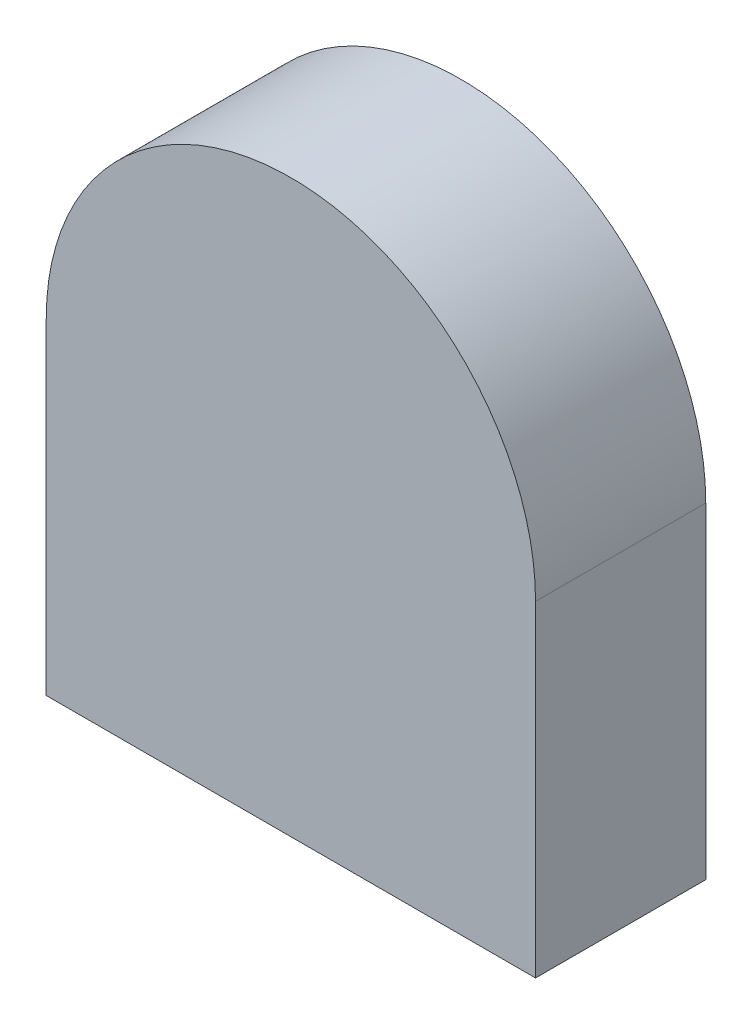
ISO-10303-21;
HEADER;
FILE_DESCRIPTION(('STEP AP214'),'2;1');
FILE_NAME('part.step','',(''),(''),'','','');
FILE_SCHEMA(('AUTOMOTIVE_DESIGN { 1 0 10303 214 1 1 1 1 }'));
ENDSEC;
DATA;
#1=APPLICATION_CONTEXT('core data for automotive mechanical design processes');
#2=APPLICATION_PROTOCOL_DEFINITION('international standard','automotive_design',2000,#1);
#3=PRODUCT_CONTEXT('',#1,'mechanical');
#4=PRODUCT('Part','Part','',(#3));
#5=PRODUCT_RELATED_PRODUCT_CATEGORY('part','',(#4));
#6=PRODUCT_DEFINITION_FORMATION('','',#4);
#7=PRODUCT_DEFINITION_CONTEXT('part definition',#1,'design');
#8=PRODUCT_DEFINITION('design','',#6,#7);
#9=PRODUCT_DEFINITION_SHAPE('','',#8);
#10=(LENGTH_UNIT() NAMED_UNIT(*) SI_UNIT(.MILLI.,.METRE.));
#11=(NAMED_UNIT(*) PLANE_ANGLE_UNIT() SI_UNIT($,.RADIAN.));
#12=(NAMED_UNIT(*) SI_UNIT($,.STERADIAN.) SOLID_ANGLE_UNIT());
#13=UNCERTAINTY_MEASURE_WITH_UNIT(LENGTH_MEASURE(1.E-05),#10,'distance_accuracy_value','');
#14=(GEOMETRIC_REPRESENTATION_CONTEXT(3) GLOBAL_UNCERTAINTY_ASSIGNED_CONTEXT((#13)) GLOBAL_UNIT_ASSIGNED_CONTEXT((#10,
#11,#12)) REPRESENTATION_CONTEXT('',''));
#15=CARTESIAN_POINT('',(0.,0.,0.));
#16=DIRECTION('',(0.,0.,1.));
#17=DIRECTION('',(1.,0.,0.));
#18=AXIS2_PLACEMENT_3D('',#15,#16,#17);
#19=CARTESIAN_POINT('',(37.5026281917929,0.,56.0983440140423));
#20=DIRECTION('',(-1.,0.,0.));
#21=DIRECTION('',(0.,0.,1.));
#22=AXIS2_PLACEMENT_3D('',#19,#20,#21);
#23=PLANE('',#22);
#24=DIRECTION('',(0.,0.,-1.));
#25=VECTOR('',#24,1.);
#26=CARTESIAN_POINT('',(37.5026281917929,13.7613125535598,56.0983440140423));
#27=LINE('',#26,#25);
#28=CARTESIAN_POINT('',(37.5026281917929,13.7613125535598,56.0983440140423));
#29=VERTEX_POINT('',#28);
#30=CARTESIAN_POINT('',(37.5026281917929,13.7613125535598,47.7483440140423));
#31=VERTEX_POINT('',#30);
#32=EDGE_CURVE('E106',#29,#31,#27,.T.);
#33=ORIENTED_EDGE('',*,*,#32,.T.);
#34=DIRECTION('',(0.,1.,0.));
#35=VECTOR('',#34,1.);
#36=CARTESIAN_POINT('',(37.5026281917929,13.7613125535598,47.7483440140423));
#37=LINE('',#36,#35);
#38=CARTESIAN_POINT('',(37.5026281917929,29.7613125535598,47.7483440140423));
#39=VERTEX_POINT('',#38);
#40=EDGE_CURVE('E117',#31,#39,#37,.T.);
#41=ORIENTED_EDGE('',*,*,#40,.T.);
#42=DIRECTION('',(0.,0.,-1.));
#43=VECTOR('',#42,1.);
#44=CARTESIAN_POINT('',(37.5026281917929,29.7613125535598,56.0983440140423));
#45=LINE('',#44,#43);
#46=CARTESIAN_POINT('',(37.5026281917929,29.7613125535598,56.0983440140423));
#47=VERTEX_POINT('',#46);
#48=EDGE_CURVE('E11',#47,#39,#45,.T.);
#49=ORIENTED_EDGE('',*,*,#48,.F.);
#50=DIRECTION('',(0.,1.,0.));
#51=VECTOR('',#50,1.);
#52=CARTESIAN_POINT('',(37.5026281917929,0.,56.0983440140423));
#53=LINE('',#52,#51);
#54=EDGE_CURVE('E138',#29,#47,#53,.T.);
#55=ORIENTED_EDGE('',*,*,#54,.F.);
#56=EDGE_LOOP('',(#33,#41,#49,#55));
#57=FACE_BOUND('',#56,.T.);
#58=ADVANCED_FACE('F34',(#57),#23,.F.);
#59=CARTESIAN_POINT('',(25.5026281917929,29.7613125535598,56.0983440140423));
#60=DIRECTION('',(0.,0.,-1.));
#61=DIRECTION('',(-1.,0.,0.));
#62=AXIS2_PLACEMENT_3D('',#59,#60,#61);
#63=CYLINDRICAL_SURFACE('',#62,12.);
#64=ORIENTED_EDGE('',*,*,#48,.T.);
#65=CARTESIAN_POINT('',(25.5026281917929,29.7613125535598,47.7483440140423));
#66=DIRECTION('',(0.,0.,-1.));
#67=DIRECTION('',(-1.,0.,0.));
#68=AXIS2_PLACEMENT_3D('',#65,#66,#67);
#69=CIRCLE('',#68,12.);
#70=CARTESIAN_POINT('',(13.5026281917929,29.7613125535598,47.7483440140423));
#71=VERTEX_POINT('',#70);
#72=EDGE_CURVE('E139',#39,#71,#69,.F.);
#73=ORIENTED_EDGE('',*,*,#72,.T.);
#74=DIRECTION('',(0.,0.,-1.));
#75=VECTOR('',#74,1.);
#76=CARTESIAN_POINT('',(13.5026281917929,29.7613125535598,56.0983440140423));
#77=LINE('',#76,#75);
#78=CARTESIAN_POINT('',(13.5026281917929,29.7613125535598,56.0983440140423));
#79=VERTEX_POINT('',#78);
#80=EDGE_CURVE('E41',#79,#71,#77,.T.);
#81=ORIENTED_EDGE('',*,*,#80,.F.);
#82=CARTESIAN_POINT('',(25.5026281917929,29.7613125535598,56.0983440140423));
#83=DIRECTION('',(0.,0.,1.));
#84=DIRECTION('',(1.,0.,0.));
#85=AXIS2_PLACEMENT_3D('',#82,#83,#84);
#86=CIRCLE('',#85,12.);
#87=EDGE_CURVE('E155',#47,#79,#86,.T.);
#88=ORIENTED_EDGE('',*,*,#87,.F.);
#89=EDGE_LOOP('',(#64,#73,#81,#88));
#90=FACE_BOUND('',#89,.T.);
#91=ADVANCED_FACE('F166',(#90),#63,.T.);
#92=CARTESIAN_POINT('',(13.5026281917929,0.,56.0983440140423));
#93=DIRECTION('',(1.,0.,0.));
#94=DIRECTION('',(0.,1.,0.));
#95=AXIS2_PLACEMENT_3D('',#92,#93,#94);
#96=PLANE('',#95);
#97=ORIENTED_EDGE('',*,*,#80,.T.);
#98=DIRECTION('',(0.,-1.,0.));
#99=VECTOR('',#98,1.);
#100=CARTESIAN_POINT('',(13.5026281917929,29.7613125535598,47.7483440140423));
#101=LINE('',#100,#99);
#102=CARTESIAN_POINT('',(13.5026281917929,13.7613125535598,47.7483440140423));
#103=VERTEX_POINT('',#102);
#104=EDGE_CURVE('E114',#71,#103,#101,.T.);
#105=ORIENTED_EDGE('',*,*,#104,.T.);
#106=DIRECTION('',(0.,0.,-1.));
#107=VECTOR('',#106,1.);
#108=CARTESIAN_POINT('',(13.5026281917929,13.7613125535598,56.0983440140423));
#109=LINE('',#108,#107);
#110=CARTESIAN_POINT('',(13.5026281917929,13.7613125535598,56.0983440140423));
#111=VERTEX_POINT('',#110);
#112=EDGE_CURVE('E97',#111,#103,#109,.T.);
#113=ORIENTED_EDGE('',*,*,#112,.F.);
#114=DIRECTION('',(0.,-1.,0.));
#115=VECTOR('',#114,1.);
#116=CARTESIAN_POINT('',(13.5026281917929,0.,56.0983440140423));
#117=LINE('',#116,#115);
#118=EDGE_CURVE('E157',#79,#111,#117,.T.);
#119=ORIENTED_EDGE('',*,*,#118,.F.);
#120=EDGE_LOOP('',(#97,#105,#113,#119));
#121=FACE_BOUND('',#120,.T.);
#122=ADVANCED_FACE('F119',(#121),#96,.F.);
#123=CARTESIAN_POINT('',(0.,13.7613125535598,56.0983440140423));
#124=DIRECTION('',(0.,1.,0.));
#125=DIRECTION('',(0.,0.,1.));
#126=AXIS2_PLACEMENT_3D('',#123,#124,#125);
#127=PLANE('',#126);
#128=ORIENTED_EDGE('',*,*,#112,.T.);
#129=DIRECTION('',(1.,0.,0.));
#130=VECTOR('',#129,1.);
#131=CARTESIAN_POINT('',(13.5026281917929,13.7613125535598,47.7483440140423));
#132=LINE('',#131,#130);
#133=EDGE_CURVE('E101',#103,#31,#132,.T.);
#134=ORIENTED_EDGE('',*,*,#133,.T.);
#135=ORIENTED_EDGE('',*,*,#32,.F.);
#136=DIRECTION('',(1.,0.,0.));
#137=VECTOR('',#136,1.);
#138=CARTESIAN_POINT('',(0.,13.7613125535598,56.0983440140423));
#139=LINE('',#138,#137);
#140=EDGE_CURVE('E102',#111,#29,#139,.T.);
#141=ORIENTED_EDGE('',*,*,#140,.F.);
#142=EDGE_LOOP('',(#128,#134,#135,#141));
#143=FACE_BOUND('',#142,.T.);
#144=ADVANCED_FACE('F99',(#143),#127,.F.);
#145=CARTESIAN_POINT('',(0.,0.,56.0983440140423));
#146=DIRECTION('',(0.,0.,1.));
#147=DIRECTION('',(1.,0.,0.));
#148=AXIS2_PLACEMENT_3D('',#145,#146,#147);
#149=PLANE('',#148);
#150=ORIENTED_EDGE('',*,*,#54,.T.);
#151=ORIENTED_EDGE('',*,*,#87,.T.);
#152=ORIENTED_EDGE('',*,*,#118,.T.);
#153=ORIENTED_EDGE('',*,*,#140,.T.);
#154=EDGE_LOOP('',(#150,#151,#152,#153));
#155=FACE_BOUND('',#154,.T.);
#156=ADVANCED_FACE('F164',(#155),#149,.T.);
#157=CARTESIAN_POINT('',(25.5026281917929,29.7613125535598,10.8701661848708));
#158=DIRECTION('',(0.,0.,1.));
#159=DIRECTION('',(1.,0.,0.));
#160=AXIS2_PLACEMENT_3D('',#157,#158,#159);
#161=CYLINDRICAL_SURFACE('',#160,10.);
#162=CARTESIAN_POINT('',(25.5026281917929,29.7613125535598,47.7483440140423));
#163=DIRECTION('',(0.,0.,-1.));
#164=DIRECTION('',(-1.,0.,0.));
#165=AXIS2_PLACEMENT_3D('',#162,#163,#164);
#166=CIRCLE('',#165,10.);
#167=CARTESIAN_POINT('',(35.5026281917929,29.7613125535598,47.7483440140423));
#168=VERTEX_POINT('',#167);
#169=CARTESIAN_POINT('',(15.5026281917929,29.7613125535598,47.7483440140423));
#170=VERTEX_POINT('',#169);
#171=EDGE_CURVE('E127',#168,#170,#166,.F.);
#172=ORIENTED_EDGE('',*,*,#171,.F.);
#173=DIRECTION('',(0.,0.,1.));
#174=VECTOR('',#173,1.);
#175=CARTESIAN_POINT('',(35.5026281917929,29.7613125535598,10.8701661848708));
#176=LINE('',#175,#174);
#177=CARTESIAN_POINT('',(35.5026281917929,29.7613125535598,55.0983440140423));
#178=VERTEX_POINT('',#177);
#179=EDGE_CURVE('E121',#168,#178,#176,.T.);
#180=ORIENTED_EDGE('',*,*,#179,.T.);
#181=CARTESIAN_POINT('',(25.5026281917929,29.7613125535598,55.0983440140423));
#182=DIRECTION('',(0.,0.,1.));
#183=DIRECTION('',(1.,0.,0.));
#184=AXIS2_PLACEMENT_3D('',#181,#182,#183);
#185=CIRCLE('',#184,10.);
#186=CARTESIAN_POINT('',(15.5026281917929,29.7613125535598,55.0983440140423));
#187=VERTEX_POINT('',#186);
#188=EDGE_CURVE('E48',#178,#187,#185,.T.);
#189=ORIENTED_EDGE('',*,*,#188,.T.);
#190=DIRECTION('',(0.,0.,1.));
#191=VECTOR('',#190,1.);
#192=CARTESIAN_POINT('',(15.5026281917929,29.7613125535598,10.8701661848708));
#193=LINE('',#192,#191);
#194=EDGE_CURVE('E150',#170,#187,#193,.T.);
#195=ORIENTED_EDGE('',*,*,#194,.F.);
#196=EDGE_LOOP('',(#172,#180,#189,#195));
#197=FACE_BOUND('',#196,.T.);
#198=ADVANCED_FACE('F181',(#197),#161,.F.);
#199=CARTESIAN_POINT('',(35.5026281917929,15.7613125535598,10.8701661848708));
#200=DIRECTION('',(1.,0.,0.));
#201=DIRECTION('',(0.,0.,-1.));
#202=AXIS2_PLACEMENT_3D('',#199,#200,#201);
#203=PLANE('',#202);
#204=DIRECTION('',(0.,1.,0.));
#205=VECTOR('',#204,1.);
#206=CARTESIAN_POINT('',(35.5026281917929,15.7613125535598,47.7483440140423));
#207=LINE('',#206,#205);
#208=CARTESIAN_POINT('',(35.5026281917929,15.7613125535598,47.7483440140423));
#209=VERTEX_POINT('',#208);
#210=EDGE_CURVE('E131',#209,#168,#207,.T.);
#211=ORIENTED_EDGE('',*,*,#210,.F.);
#212=DIRECTION('',(0.,0.,1.));
#213=VECTOR('',#212,1.);
#214=CARTESIAN_POINT('',(35.5026281917929,15.7613125535598,10.8701661848708));
#215=LINE('',#214,#213);
#216=CARTESIAN_POINT('',(35.5026281917929,15.7613125535598,55.0983440140423));
#217=VERTEX_POINT('',#216);
#218=EDGE_CURVE('E144',#209,#217,#215,.T.);
#219=ORIENTED_EDGE('',*,*,#218,.T.);
#220=DIRECTION('',(0.,1.,0.));
#221=VECTOR('',#220,1.);
#222=CARTESIAN_POINT('',(35.5026281917929,15.7613125535598,55.0983440140423));
#223=LINE('',#222,#221);
#224=EDGE_CURVE('E53',#217,#178,#223,.T.);
#225=ORIENTED_EDGE('',*,*,#224,.T.);
#226=ORIENTED_EDGE('',*,*,#179,.F.);
#227=EDGE_LOOP('',(#211,#219,#225,#226));
#228=FACE_BOUND('',#227,.T.);
#229=ADVANCED_FACE('F187',(#228),#203,.F.);
#230=CARTESIAN_POINT('',(15.5026281917929,15.7613125535598,10.8701661848708));
#231=DIRECTION('',(0.,-1.,0.));
#232=DIRECTION('',(0.,0.,-1.));
#233=AXIS2_PLACEMENT_3D('',#230,#231,#232);
#234=PLANE('',#233);
#235=DIRECTION('',(1.,0.,0.));
#236=VECTOR('',#235,1.);
#237=CARTESIAN_POINT('',(15.5026281917929,15.7613125535598,47.7483440140423));
#238=LINE('',#237,#236);
#239=CARTESIAN_POINT('',(15.5026281917929,15.7613125535598,47.7483440140423));
#240=VERTEX_POINT('',#239);
#241=EDGE_CURVE('E135',#240,#209,#238,.T.);
#242=ORIENTED_EDGE('',*,*,#241,.F.);
#243=DIRECTION('',(0.,0.,1.));
#244=VECTOR('',#243,1.);
#245=CARTESIAN_POINT('',(15.5026281917929,15.7613125535598,10.8701661848708));
#246=LINE('',#245,#244);
#247=CARTESIAN_POINT('',(15.5026281917929,15.7613125535598,55.0983440140423));
#248=VERTEX_POINT('',#247);
#249=EDGE_CURVE('E146',#240,#248,#246,.T.);
#250=ORIENTED_EDGE('',*,*,#249,.T.);
#251=DIRECTION('',(1.,0.,0.));
#252=VECTOR('',#251,1.);
#253=CARTESIAN_POINT('',(15.5026281917929,15.7613125535598,55.0983440140423));
#254=LINE('',#253,#252);
#255=EDGE_CURVE('E149',#248,#217,#254,.T.);
#256=ORIENTED_EDGE('',*,*,#255,.T.);
#257=ORIENTED_EDGE('',*,*,#218,.F.);
#258=EDGE_LOOP('',(#242,#250,#256,#257));
#259=FACE_BOUND('',#258,.T.);
#260=ADVANCED_FACE('F191',(#259),#234,.F.);
#261=CARTESIAN_POINT('',(15.5026281917929,29.7613125535598,10.8701661848708));
#262=DIRECTION('',(-1.,0.,0.));
#263=DIRECTION('',(0.,-1.,0.));
#264=AXIS2_PLACEMENT_3D('',#261,#262,#263);
#265=PLANE('',#264);
#266=DIRECTION('',(0.,-1.,0.));
#267=VECTOR('',#266,1.);
#268=CARTESIAN_POINT('',(15.5026281917929,29.7613125535598,47.7483440140423));
#269=LINE('',#268,#267);
#270=EDGE_CURVE('E130',#170,#240,#269,.T.);
#271=ORIENTED_EDGE('',*,*,#270,.F.);
#272=ORIENTED_EDGE('',*,*,#194,.T.);
#273=DIRECTION('',(0.,-1.,0.));
#274=VECTOR('',#273,1.);
#275=CARTESIAN_POINT('',(15.5026281917929,29.7613125535598,55.0983440140423));
#276=LINE('',#275,#274);
#277=EDGE_CURVE('E134',#187,#248,#276,.T.);
#278=ORIENTED_EDGE('',*,*,#277,.T.);
#279=ORIENTED_EDGE('',*,*,#249,.F.);
#280=EDGE_LOOP('',(#271,#272,#278,#279));
#281=FACE_BOUND('',#280,.T.);
#282=ADVANCED_FACE('F184',(#281),#265,.F.);
#283=CARTESIAN_POINT('',(1.50262819179287,15.7613125535598,47.7483440140423));
#284=DIRECTION('',(0.,0.,-1.));
#285=DIRECTION('',(-1.,0.,0.));
#286=AXIS2_PLACEMENT_3D('',#283,#284,#285);
#287=PLANE('',#286);
#288=ORIENTED_EDGE('',*,*,#72,.F.);
#289=ORIENTED_EDGE('',*,*,#40,.F.);
#290=ORIENTED_EDGE('',*,*,#133,.F.);
#291=ORIENTED_EDGE('',*,*,#104,.F.);
#292=EDGE_LOOP('',(#288,#289,#290,#291));
#293=FACE_BOUND('',#292,.T.);
#294=ORIENTED_EDGE('',*,*,#210,.T.);
#295=ORIENTED_EDGE('',*,*,#171,.T.);
#296=ORIENTED_EDGE('',*,*,#270,.T.);
#297=ORIENTED_EDGE('',*,*,#241,.T.);
#298=EDGE_LOOP('',(#294,#295,#296,#297));
#299=FACE_BOUND('',#298,.T.);
#300=ADVANCED_FACE('F112',(#293,#299),#287,.T.);
#301=CARTESIAN_POINT('',(0.,0.,55.0983440140423));
#302=DIRECTION('',(0.,0.,1.));
#303=DIRECTION('',(1.,0.,0.));
#304=AXIS2_PLACEMENT_3D('',#301,#302,#303);
#305=PLANE('',#304);
#306=ORIENTED_EDGE('',*,*,#188,.F.);
#307=ORIENTED_EDGE('',*,*,#224,.F.);
#308=ORIENTED_EDGE('',*,*,#255,.F.);
#309=ORIENTED_EDGE('',*,*,#277,.F.);
#310=EDGE_LOOP('',(#306,#307,#308,#309));
#311=FACE_BOUND('',#310,.T.);
#312=ADVANCED_FACE('F176',(#311),#305,.F.);
#313=CLOSED_SHELL('',(#58,#91,#122,#144,#156,#198,#229,#260,#282,#300,#312));
#314=MANIFOLD_SOLID_BREP('B2',#313);
#315=ADVANCED_BREP_SHAPE_REPRESENTATION('',(#18,#314),#14);
#316=SHAPE_DEFINITION_REPRESENTATION(#9,#315);
ENDSEC;
END-ISO-10303-21;
